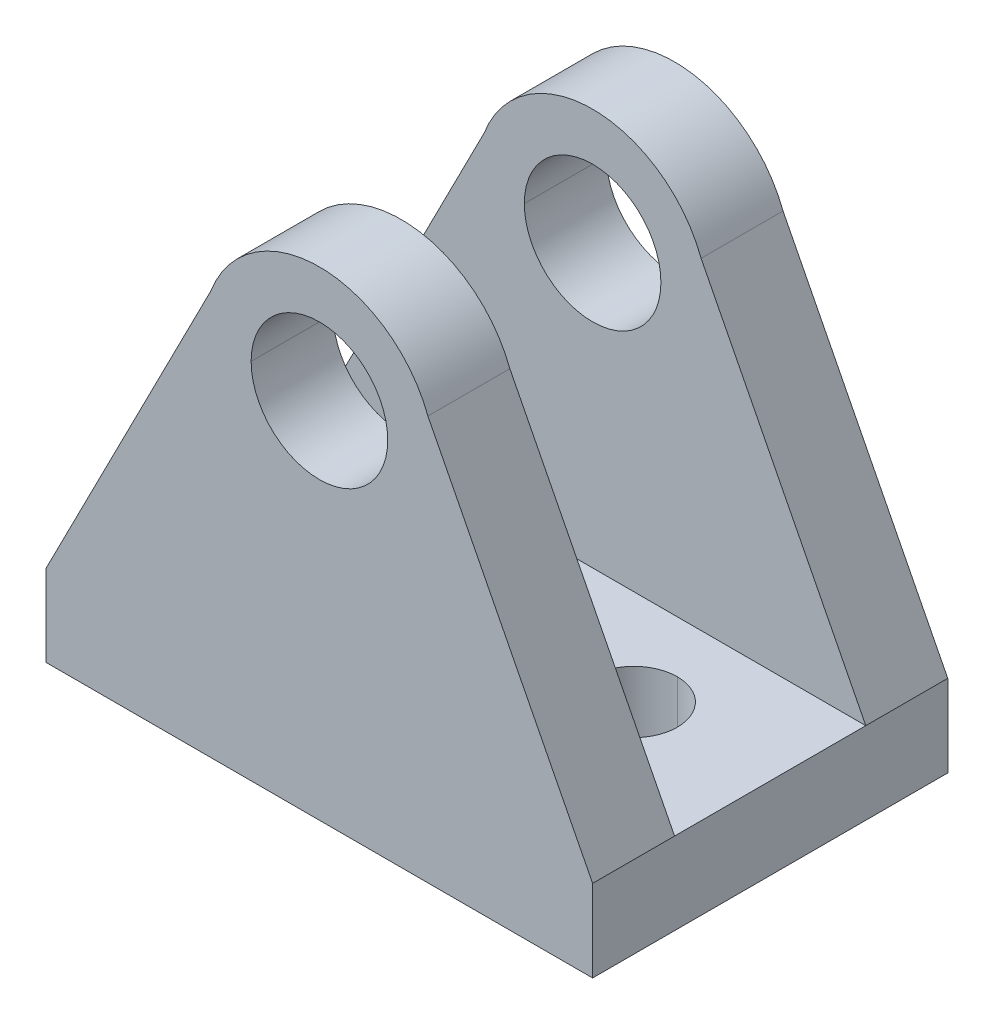
ISO-10303-21;
HEADER;
FILE_DESCRIPTION(('STEP AP214'),'2;1');
FILE_NAME('part.step','',(''),(''),'','','');
FILE_SCHEMA(('AUTOMOTIVE_DESIGN { 1 0 10303 214 1 1 1 1 }'));
ENDSEC;
DATA;
#1=APPLICATION_CONTEXT('core data for automotive mechanical design processes');
#2=APPLICATION_PROTOCOL_DEFINITION('international standard','automotive_design',2000,#1);
#3=PRODUCT_CONTEXT('',#1,'mechanical');
#4=PRODUCT('Part','Part','',(#3));
#5=PRODUCT_RELATED_PRODUCT_CATEGORY('part','',(#4));
#6=PRODUCT_DEFINITION_FORMATION('','',#4);
#7=PRODUCT_DEFINITION_CONTEXT('part definition',#1,'design');
#8=PRODUCT_DEFINITION('design','',#6,#7);
#9=PRODUCT_DEFINITION_SHAPE('','',#8);
#10=(LENGTH_UNIT() NAMED_UNIT(*) SI_UNIT(.MILLI.,.METRE.));
#11=(NAMED_UNIT(*) PLANE_ANGLE_UNIT() SI_UNIT($,.RADIAN.));
#12=(NAMED_UNIT(*) SI_UNIT($,.STERADIAN.) SOLID_ANGLE_UNIT());
#13=UNCERTAINTY_MEASURE_WITH_UNIT(LENGTH_MEASURE(1.E-05),#10,'distance_accuracy_value','');
#14=(GEOMETRIC_REPRESENTATION_CONTEXT(3) GLOBAL_UNCERTAINTY_ASSIGNED_CONTEXT((#13)) GLOBAL_UNIT_ASSIGNED_CONTEXT((#10,
#11,#12)) REPRESENTATION_CONTEXT('',''));
#15=CARTESIAN_POINT('',(0.,0.,0.));
#16=DIRECTION('',(0.,0.,1.));
#17=DIRECTION('',(1.,0.,0.));
#18=AXIS2_PLACEMENT_3D('',#15,#16,#17);
#19=CARTESIAN_POINT('',(35.3430691595237,13.3000053075812,-40.2194258680596));
#20=DIRECTION('',(0.,0.,-1.));
#21=DIRECTION('',(-1.,0.,0.));
#22=AXIS2_PLACEMENT_3D('',#19,#20,#21);
#23=CYLINDRICAL_SURFACE('',#22,2.5);
#24=CARTESIAN_POINT('',(35.3430691595237,13.3000053075812,-41.2194258680597));
#25=DIRECTION('',(0.,0.,-1.));
#26=DIRECTION('',(-1.,0.,0.));
#27=AXIS2_PLACEMENT_3D('',#24,#25,#26);
#28=CIRCLE('',#27,2.5);
#29=CARTESIAN_POINT('',(37.8430691595238,13.3000053075812,-41.2194258680597));
#30=VERTEX_POINT('',#29);
#31=CARTESIAN_POINT('',(32.8430691595237,13.3000053075812,-41.2194258680597));
#32=VERTEX_POINT('',#31);
#33=EDGE_CURVE('E41',#30,#32,#28,.T.);
#34=ORIENTED_EDGE('',*,*,#33,.F.);
#35=DIRECTION('',(0.,0.,-1.));
#36=VECTOR('',#35,1.);
#37=CARTESIAN_POINT('',(37.8430691595238,13.3000053075812,-40.2194258680596));
#38=LINE('',#37,#36);
#39=CARTESIAN_POINT('',(37.8430691595238,13.3000053075812,-44.2194258680597));
#40=VERTEX_POINT('',#39);
#41=EDGE_CURVE('E11',#30,#40,#38,.T.);
#42=ORIENTED_EDGE('',*,*,#41,.T.);
#43=CARTESIAN_POINT('',(35.3430691595237,13.3000053075812,-44.2194258680597));
#44=DIRECTION('',(0.,0.,-1.));
#45=DIRECTION('',(-1.,0.,0.));
#46=AXIS2_PLACEMENT_3D('',#43,#44,#45);
#47=CIRCLE('',#46,2.5);
#48=CARTESIAN_POINT('',(32.8430691595237,13.3000053075812,-44.2194258680597));
#49=VERTEX_POINT('',#48);
#50=EDGE_CURVE('E27',#40,#49,#47,.T.);
#51=ORIENTED_EDGE('',*,*,#50,.T.);
#52=DIRECTION('',(0.,0.,-1.));
#53=VECTOR('',#52,1.);
#54=CARTESIAN_POINT('',(32.8430691595237,13.3000053075812,-40.2194258680596));
#55=LINE('',#54,#53);
#56=EDGE_CURVE('E260',#32,#49,#55,.T.);
#57=ORIENTED_EDGE('',*,*,#56,.F.);
#58=EDGE_LOOP('',(#34,#42,#51,#57));
#59=FACE_BOUND('',#58,.T.);
#60=ADVANCED_FACE('F16',(#59),#23,.F.);
#61=CARTESIAN_POINT('',(35.3430691595237,13.3000053075812,-40.2194258680596));
#62=DIRECTION('',(0.,0.,-1.));
#63=DIRECTION('',(-1.,0.,0.));
#64=AXIS2_PLACEMENT_3D('',#61,#62,#63);
#65=CYLINDRICAL_SURFACE('',#64,2.5);
#66=CARTESIAN_POINT('',(35.3430691595237,13.3000053075812,-51.2194258680596));
#67=DIRECTION('',(0.,0.,1.));
#68=DIRECTION('',(1.,0.,0.));
#69=AXIS2_PLACEMENT_3D('',#66,#67,#68);
#70=CIRCLE('',#69,2.5);
#71=CARTESIAN_POINT('',(32.8430691595237,13.3000053075812,-51.2194258680596));
#72=VERTEX_POINT('',#71);
#73=CARTESIAN_POINT('',(37.8430691595238,13.3000053075812,-51.2194258680596));
#74=VERTEX_POINT('',#73);
#75=EDGE_CURVE('E303',#72,#74,#70,.T.);
#76=ORIENTED_EDGE('',*,*,#75,.T.);
#77=DIRECTION('',(0.,0.,-1.));
#78=VECTOR('',#77,1.);
#79=CARTESIAN_POINT('',(37.8430691595238,13.3000053075812,-40.2194258680596));
#80=LINE('',#79,#78);
#81=CARTESIAN_POINT('',(37.8430691595238,13.3000053075812,-54.2194258680596));
#82=VERTEX_POINT('',#81);
#83=EDGE_CURVE('E220',#74,#82,#80,.T.);
#84=ORIENTED_EDGE('',*,*,#83,.T.);
#85=CARTESIAN_POINT('',(35.3430691595237,13.3000053075812,-54.2194258680596));
#86=DIRECTION('',(0.,0.,-1.));
#87=DIRECTION('',(-1.,0.,0.));
#88=AXIS2_PLACEMENT_3D('',#85,#86,#87);
#89=CIRCLE('',#88,2.5);
#90=CARTESIAN_POINT('',(32.8430691595237,13.3000053075812,-54.2194258680596));
#91=VERTEX_POINT('',#90);
#92=EDGE_CURVE('E217',#82,#91,#89,.T.);
#93=ORIENTED_EDGE('',*,*,#92,.T.);
#94=DIRECTION('',(0.,0.,-1.));
#95=VECTOR('',#94,1.);
#96=CARTESIAN_POINT('',(32.8430691595237,13.3000053075812,-40.2194258680596));
#97=LINE('',#96,#95);
#98=EDGE_CURVE('E285',#72,#91,#97,.T.);
#99=ORIENTED_EDGE('',*,*,#98,.F.);
#100=EDGE_LOOP('',(#76,#84,#93,#99));
#101=FACE_BOUND('',#100,.T.);
#102=ADVANCED_FACE('F460',(#101),#65,.F.);
#103=CARTESIAN_POINT('',(30.3430756374335,3.,-47.7194258680598));
#104=DIRECTION('',(0.,-1.,0.));
#105=DIRECTION('',(0.,0.,-1.));
#106=AXIS2_PLACEMENT_3D('',#103,#104,#105);
#107=CYLINDRICAL_SURFACE('',#106,1.59999999999983);
#108=CARTESIAN_POINT('',(30.3430756374335,3.,-47.7194258680598));
#109=DIRECTION('',(0.,1.,0.));
#110=DIRECTION('',(0.,0.,1.));
#111=AXIS2_PLACEMENT_3D('',#108,#109,#110);
#112=CIRCLE('',#111,1.59999999999983);
#113=CARTESIAN_POINT('',(30.3430756374335,3.,-49.3194258680596));
#114=VERTEX_POINT('',#113);
#115=CARTESIAN_POINT('',(30.3430756374335,3.,-46.1194258680599));
#116=VERTEX_POINT('',#115);
#117=EDGE_CURVE('E221',#114,#116,#112,.T.);
#118=ORIENTED_EDGE('',*,*,#117,.T.);
#119=DIRECTION('',(0.,-1.,0.));
#120=VECTOR('',#119,1.);
#121=CARTESIAN_POINT('',(30.3430756374335,3.,-46.1194258680599));
#122=LINE('',#121,#120);
#123=CARTESIAN_POINT('',(30.3430756374335,0.,-46.1194258680599));
#124=VERTEX_POINT('',#123);
#125=EDGE_CURVE('E215',#116,#124,#122,.T.);
#126=ORIENTED_EDGE('',*,*,#125,.T.);
#127=CARTESIAN_POINT('',(30.3430756374335,0.,-47.7194258680598));
#128=DIRECTION('',(0.,1.,0.));
#129=DIRECTION('',(0.,0.,1.));
#130=AXIS2_PLACEMENT_3D('',#127,#128,#129);
#131=CIRCLE('',#130,1.59999999999983);
#132=CARTESIAN_POINT('',(30.3430756374335,0.,-49.3194258680596));
#133=VERTEX_POINT('',#132);
#134=EDGE_CURVE('E235',#133,#124,#131,.T.);
#135=ORIENTED_EDGE('',*,*,#134,.F.);
#136=DIRECTION('',(0.,-1.,0.));
#137=VECTOR('',#136,1.);
#138=CARTESIAN_POINT('',(30.3430756374335,3.,-49.3194258680596));
#139=LINE('',#138,#137);
#140=EDGE_CURVE('E241',#114,#133,#139,.T.);
#141=ORIENTED_EDGE('',*,*,#140,.F.);
#142=EDGE_LOOP('',(#118,#126,#135,#141));
#143=FACE_BOUND('',#142,.T.);
#144=ADVANCED_FACE('F444',(#143),#107,.F.);
#145=CARTESIAN_POINT('',(40.3430756374337,3.,-47.7194258680598));
#146=DIRECTION('',(0.,-1.,0.));
#147=DIRECTION('',(0.,0.,-1.));
#148=AXIS2_PLACEMENT_3D('',#145,#146,#147);
#149=CYLINDRICAL_SURFACE('',#148,1.59999999999983);
#150=CARTESIAN_POINT('',(40.3430756374337,3.,-47.7194258680598));
#151=DIRECTION('',(0.,1.,0.));
#152=DIRECTION('',(0.,0.,1.));
#153=AXIS2_PLACEMENT_3D('',#150,#151,#152);
#154=CIRCLE('',#153,1.59999999999983);
#155=CARTESIAN_POINT('',(40.3430756374337,3.,-49.3194258680596));
#156=VERTEX_POINT('',#155);
#157=CARTESIAN_POINT('',(40.3430756374337,3.,-46.1194258680599));
#158=VERTEX_POINT('',#157);
#159=EDGE_CURVE('E274',#156,#158,#154,.T.);
#160=ORIENTED_EDGE('',*,*,#159,.T.);
#161=DIRECTION('',(0.,-1.,0.));
#162=VECTOR('',#161,1.);
#163=CARTESIAN_POINT('',(40.3430756374337,3.,-46.1194258680599));
#164=LINE('',#163,#162);
#165=CARTESIAN_POINT('',(40.3430756374337,0.,-46.1194258680599));
#166=VERTEX_POINT('',#165);
#167=EDGE_CURVE('E270',#158,#166,#164,.T.);
#168=ORIENTED_EDGE('',*,*,#167,.T.);
#169=CARTESIAN_POINT('',(40.3430756374337,0.,-47.7194258680598));
#170=DIRECTION('',(0.,1.,0.));
#171=DIRECTION('',(0.,0.,1.));
#172=AXIS2_PLACEMENT_3D('',#169,#170,#171);
#173=CIRCLE('',#172,1.59999999999983);
#174=CARTESIAN_POINT('',(40.3430756374337,0.,-49.3194258680596));
#175=VERTEX_POINT('',#174);
#176=EDGE_CURVE('E350',#175,#166,#173,.T.);
#177=ORIENTED_EDGE('',*,*,#176,.F.);
#178=DIRECTION('',(0.,-1.,0.));
#179=VECTOR('',#178,1.);
#180=CARTESIAN_POINT('',(40.3430756374337,3.,-49.3194258680596));
#181=LINE('',#180,#179);
#182=EDGE_CURVE('E264',#156,#175,#181,.T.);
#183=ORIENTED_EDGE('',*,*,#182,.F.);
#184=EDGE_LOOP('',(#160,#168,#177,#183));
#185=FACE_BOUND('',#184,.T.);
#186=ADVANCED_FACE('F431',(#185),#149,.F.);
#187=CARTESIAN_POINT('',(0.,3.,0.));
#188=DIRECTION('',(0.,-1.,0.));
#189=DIRECTION('',(0.,0.,-1.));
#190=AXIS2_PLACEMENT_3D('',#187,#188,#189);
#191=PLANE('',#190);
#192=DIRECTION('',(0.,0.,-1.));
#193=VECTOR('',#192,1.);
#194=CARTESIAN_POINT('',(45.3430756374336,3.,-51.2194258680596));
#195=LINE('',#194,#193);
#196=CARTESIAN_POINT('',(45.3430756374336,3.,-44.2194258680597));
#197=VERTEX_POINT('',#196);
#198=CARTESIAN_POINT('',(45.3430756374336,3.,-51.2194258680596));
#199=VERTEX_POINT('',#198);
#200=EDGE_CURVE('E20',#197,#199,#195,.T.);
#201=ORIENTED_EDGE('',*,*,#200,.T.);
#202=DIRECTION('',(-1.,0.,0.));
#203=VECTOR('',#202,1.);
#204=CARTESIAN_POINT('',(45.3430756374336,3.,-51.2194258680596));
#205=LINE('',#204,#203);
#206=CARTESIAN_POINT('',(25.3430756374336,3.,-51.2194258680596));
#207=VERTEX_POINT('',#206);
#208=EDGE_CURVE('E222',#199,#207,#205,.T.);
#209=ORIENTED_EDGE('',*,*,#208,.T.);
#210=DIRECTION('',(0.,0.,1.));
#211=VECTOR('',#210,1.);
#212=CARTESIAN_POINT('',(25.3430756374336,3.,-51.2194258680596));
#213=LINE('',#212,#211);
#214=CARTESIAN_POINT('',(25.3430756374336,3.,-44.2194258680597));
#215=VERTEX_POINT('',#214);
#216=EDGE_CURVE('E180',#207,#215,#213,.T.);
#217=ORIENTED_EDGE('',*,*,#216,.T.);
#218=DIRECTION('',(1.,0.,0.));
#219=VECTOR('',#218,1.);
#220=CARTESIAN_POINT('',(45.3430756374336,3.,-44.2194258680597));
#221=LINE('',#220,#219);
#222=EDGE_CURVE('E353',#215,#197,#221,.T.);
#223=ORIENTED_EDGE('',*,*,#222,.T.);
#224=EDGE_LOOP('',(#201,#209,#217,#223));
#225=FACE_BOUND('',#224,.T.);
#226=ORIENTED_EDGE('',*,*,#159,.F.);
#227=CARTESIAN_POINT('',(40.3430756374337,3.,-47.7194258680598));
#228=DIRECTION('',(0.,1.,0.));
#229=DIRECTION('',(0.,0.,1.));
#230=AXIS2_PLACEMENT_3D('',#227,#228,#229);
#231=CIRCLE('',#230,1.59999999999983);
#232=EDGE_CURVE('E268',#158,#156,#231,.T.);
#233=ORIENTED_EDGE('',*,*,#232,.F.);
#234=EDGE_LOOP('',(#226,#233));
#235=FACE_BOUND('',#234,.T.);
#236=ORIENTED_EDGE('',*,*,#117,.F.);
#237=CARTESIAN_POINT('',(30.3430756374335,3.,-47.7194258680598));
#238=DIRECTION('',(0.,1.,0.));
#239=DIRECTION('',(0.,0.,1.));
#240=AXIS2_PLACEMENT_3D('',#237,#238,#239);
#241=CIRCLE('',#240,1.59999999999983);
#242=EDGE_CURVE('E269',#116,#114,#241,.T.);
#243=ORIENTED_EDGE('',*,*,#242,.F.);
#244=EDGE_LOOP('',(#236,#243));
#245=FACE_BOUND('',#244,.T.);
#246=ADVANCED_FACE('F384',(#225,#235,#245),#191,.F.);
#247=CARTESIAN_POINT('',(0.,0.,0.));
#248=DIRECTION('',(0.,-1.,0.));
#249=DIRECTION('',(0.,0.,-1.));
#250=AXIS2_PLACEMENT_3D('',#247,#248,#249);
#251=PLANE('',#250);
#252=DIRECTION('',(0.,0.,-1.));
#253=VECTOR('',#252,1.);
#254=CARTESIAN_POINT('',(45.3430756374336,0.,-51.2194258680596));
#255=LINE('',#254,#253);
#256=CARTESIAN_POINT('',(45.3430756374336,0.,-41.2194258680597));
#257=VERTEX_POINT('',#256);
#258=CARTESIAN_POINT('',(45.3430756374336,0.,-54.2194258680596));
#259=VERTEX_POINT('',#258);
#260=EDGE_CURVE('E236',#257,#259,#255,.T.);
#261=ORIENTED_EDGE('',*,*,#260,.F.);
#262=DIRECTION('',(1.,0.,0.));
#263=VECTOR('',#262,1.);
#264=CARTESIAN_POINT('',(25.3430756374336,0.,-41.2194258680597));
#265=LINE('',#264,#263);
#266=CARTESIAN_POINT('',(25.3430756374336,0.,-41.2194258680597));
#267=VERTEX_POINT('',#266);
#268=EDGE_CURVE('E242',#267,#257,#265,.T.);
#269=ORIENTED_EDGE('',*,*,#268,.F.);
#270=DIRECTION('',(0.,0.,1.));
#271=VECTOR('',#270,1.);
#272=CARTESIAN_POINT('',(25.3430756374336,0.,-51.2194258680596));
#273=LINE('',#272,#271);
#274=CARTESIAN_POINT('',(25.3430756374336,0.,-54.2194258680596));
#275=VERTEX_POINT('',#274);
#276=EDGE_CURVE('E339',#275,#267,#273,.T.);
#277=ORIENTED_EDGE('',*,*,#276,.F.);
#278=DIRECTION('',(-1.,0.,0.));
#279=VECTOR('',#278,1.);
#280=CARTESIAN_POINT('',(45.3430756374336,0.,-54.2194258680596));
#281=LINE('',#280,#279);
#282=EDGE_CURVE('E197',#259,#275,#281,.T.);
#283=ORIENTED_EDGE('',*,*,#282,.F.);
#284=EDGE_LOOP('',(#261,#269,#277,#283));
#285=FACE_BOUND('',#284,.T.);
#286=ORIENTED_EDGE('',*,*,#176,.T.);
#287=CARTESIAN_POINT('',(40.3430756374337,0.,-47.7194258680598));
#288=DIRECTION('',(0.,1.,0.));
#289=DIRECTION('',(0.,0.,1.));
#290=AXIS2_PLACEMENT_3D('',#287,#288,#289);
#291=CIRCLE('',#290,1.59999999999983);
#292=EDGE_CURVE('E354',#166,#175,#291,.T.);
#293=ORIENTED_EDGE('',*,*,#292,.T.);
#294=EDGE_LOOP('',(#286,#293));
#295=FACE_BOUND('',#294,.T.);
#296=ORIENTED_EDGE('',*,*,#134,.T.);
#297=CARTESIAN_POINT('',(30.3430756374335,0.,-47.7194258680598));
#298=DIRECTION('',(0.,1.,0.));
#299=DIRECTION('',(0.,0.,1.));
#300=AXIS2_PLACEMENT_3D('',#297,#298,#299);
#301=CIRCLE('',#300,1.59999999999983);
#302=EDGE_CURVE('E231',#124,#133,#301,.T.);
#303=ORIENTED_EDGE('',*,*,#302,.T.);
#304=EDGE_LOOP('',(#296,#303));
#305=FACE_BOUND('',#304,.T.);
#306=ADVANCED_FACE('F433',(#285,#295,#305),#251,.T.);
#307=CARTESIAN_POINT('',(45.3430756374336,3.,-51.2194258680596));
#308=DIRECTION('',(-1.,0.,0.));
#309=DIRECTION('',(0.,0.,1.));
#310=AXIS2_PLACEMENT_3D('',#307,#308,#309);
#311=PLANE('',#310);
#312=ORIENTED_EDGE('',*,*,#260,.T.);
#313=DIRECTION('',(0.,-1.,0.));
#314=VECTOR('',#313,1.);
#315=CARTESIAN_POINT('',(45.3430756374336,3.,-54.2194258680596));
#316=LINE('',#315,#314);
#317=CARTESIAN_POINT('',(45.3430756374336,3.,-54.2194258680596));
#318=VERTEX_POINT('',#317);
#319=EDGE_CURVE('E289',#318,#259,#316,.T.);
#320=ORIENTED_EDGE('',*,*,#319,.F.);
#321=DIRECTION('',(0.,0.,1.));
#322=VECTOR('',#321,1.);
#323=CARTESIAN_POINT('',(45.3430756374336,3.,-54.2194258680596));
#324=LINE('',#323,#322);
#325=EDGE_CURVE('E333',#318,#199,#324,.T.);
#326=ORIENTED_EDGE('',*,*,#325,.T.);
#327=ORIENTED_EDGE('',*,*,#200,.F.);
#328=DIRECTION('',(0.,0.,-1.));
#329=VECTOR('',#328,1.);
#330=CARTESIAN_POINT('',(45.3430756374336,3.,-41.2194258680597));
#331=LINE('',#330,#329);
#332=CARTESIAN_POINT('',(45.3430756374336,3.,-41.2194258680597));
#333=VERTEX_POINT('',#332);
#334=EDGE_CURVE('E312',#333,#197,#331,.T.);
#335=ORIENTED_EDGE('',*,*,#334,.F.);
#336=DIRECTION('',(0.,1.,0.));
#337=VECTOR('',#336,1.);
#338=CARTESIAN_POINT('',(45.3430756374336,3.,-41.2194258680597));
#339=LINE('',#338,#337);
#340=EDGE_CURVE('E255',#257,#333,#339,.T.);
#341=ORIENTED_EDGE('',*,*,#340,.F.);
#342=EDGE_LOOP('',(#312,#320,#326,#327,#335,#341));
#343=FACE_BOUND('',#342,.T.);
#344=ADVANCED_FACE('F436',(#343),#311,.F.);
#345=CARTESIAN_POINT('',(25.3430756374336,3.,-51.2194258680596));
#346=DIRECTION('',(1.,0.,0.));
#347=DIRECTION('',(0.,1.,0.));
#348=AXIS2_PLACEMENT_3D('',#345,#346,#347);
#349=PLANE('',#348);
#350=ORIENTED_EDGE('',*,*,#276,.T.);
#351=DIRECTION('',(0.,-1.,0.));
#352=VECTOR('',#351,1.);
#353=CARTESIAN_POINT('',(25.3430756374336,3.,-41.2194258680597));
#354=LINE('',#353,#352);
#355=CARTESIAN_POINT('',(25.3430756374336,3.,-41.2194258680597));
#356=VERTEX_POINT('',#355);
#357=EDGE_CURVE('E237',#356,#267,#354,.T.);
#358=ORIENTED_EDGE('',*,*,#357,.F.);
#359=DIRECTION('',(0.,0.,-1.));
#360=VECTOR('',#359,1.);
#361=CARTESIAN_POINT('',(25.3430756374336,3.,-41.2194258680597));
#362=LINE('',#361,#360);
#363=EDGE_CURVE('E342',#356,#215,#362,.T.);
#364=ORIENTED_EDGE('',*,*,#363,.T.);
#365=ORIENTED_EDGE('',*,*,#216,.F.);
#366=DIRECTION('',(0.,0.,1.));
#367=VECTOR('',#366,1.);
#368=CARTESIAN_POINT('',(25.3430756374336,3.,-54.2194258680596));
#369=LINE('',#368,#367);
#370=CARTESIAN_POINT('',(25.3430756374336,3.,-54.2194258680596));
#371=VERTEX_POINT('',#370);
#372=EDGE_CURVE('E174',#371,#207,#369,.T.);
#373=ORIENTED_EDGE('',*,*,#372,.F.);
#374=DIRECTION('',(0.,1.,0.));
#375=VECTOR('',#374,1.);
#376=CARTESIAN_POINT('',(25.3430756374336,3.,-54.2194258680596));
#377=LINE('',#376,#375);
#378=EDGE_CURVE('E178',#275,#371,#377,.T.);
#379=ORIENTED_EDGE('',*,*,#378,.F.);
#380=EDGE_LOOP('',(#350,#358,#364,#365,#373,#379));
#381=FACE_BOUND('',#380,.T.);
#382=ADVANCED_FACE('F177',(#381),#349,.F.);
#383=CARTESIAN_POINT('',(40.3430756374337,3.,-47.7194258680598));
#384=DIRECTION('',(0.,-1.,0.));
#385=DIRECTION('',(0.,0.,-1.));
#386=AXIS2_PLACEMENT_3D('',#383,#384,#385);
#387=CYLINDRICAL_SURFACE('',#386,1.59999999999983);
#388=ORIENTED_EDGE('',*,*,#167,.F.);
#389=ORIENTED_EDGE('',*,*,#232,.T.);
#390=ORIENTED_EDGE('',*,*,#182,.T.);
#391=ORIENTED_EDGE('',*,*,#292,.F.);
#392=EDGE_LOOP('',(#388,#389,#390,#391));
#393=FACE_BOUND('',#392,.T.);
#394=ADVANCED_FACE('F425',(#393),#387,.F.);
#395=CARTESIAN_POINT('',(30.3430756374335,3.,-47.7194258680598));
#396=DIRECTION('',(0.,-1.,0.));
#397=DIRECTION('',(0.,0.,-1.));
#398=AXIS2_PLACEMENT_3D('',#395,#396,#397);
#399=CYLINDRICAL_SURFACE('',#398,1.59999999999983);
#400=ORIENTED_EDGE('',*,*,#125,.F.);
#401=ORIENTED_EDGE('',*,*,#242,.T.);
#402=ORIENTED_EDGE('',*,*,#140,.T.);
#403=ORIENTED_EDGE('',*,*,#302,.F.);
#404=EDGE_LOOP('',(#400,#401,#402,#403));
#405=FACE_BOUND('',#404,.T.);
#406=ADVANCED_FACE('F448',(#405),#399,.F.);
#407=CARTESIAN_POINT('',(35.3430756374336,13.3,-44.2194258680597));
#408=DIRECTION('',(0.,0.,-1.));
#409=DIRECTION('',(0.,-1.,0.));
#410=AXIS2_PLACEMENT_3D('',#407,#408,#409);
#411=PLANE('',#410);
#412=ORIENTED_EDGE('',*,*,#222,.F.);
#413=DIRECTION('',(-0.45499090568648,-0.890496084069209,0.));
#414=VECTOR('',#413,1.);
#415=CARTESIAN_POINT('',(25.3430756374336,3.,-44.2194258680597));
#416=LINE('',#415,#414);
#417=CARTESIAN_POINT('',(31.3721787218253,14.8,-44.2194258680597));
#418=VERTEX_POINT('',#417);
#419=EDGE_CURVE('E246',#418,#215,#416,.T.);
#420=ORIENTED_EDGE('',*,*,#419,.F.);
#421=CARTESIAN_POINT('',(35.3430756374336,13.3,-44.2194258680597));
#422=DIRECTION('',(0.,0.,1.));
#423=DIRECTION('',(-1.,0.,0.));
#424=AXIS2_PLACEMENT_3D('',#421,#422,#423);
#425=CIRCLE('',#424,4.24476410585876);
#426=CARTESIAN_POINT('',(39.3139725530418,14.8,-44.2194258680597));
#427=VERTEX_POINT('',#426);
#428=EDGE_CURVE('E320',#427,#418,#425,.T.);
#429=ORIENTED_EDGE('',*,*,#428,.F.);
#430=DIRECTION('',(-0.45499090568648,0.890496084069209,0.));
#431=VECTOR('',#430,1.);
#432=CARTESIAN_POINT('',(39.3139725530418,14.8,-44.2194258680597));
#433=LINE('',#432,#431);
#434=EDGE_CURVE('E278',#197,#427,#433,.T.);
#435=ORIENTED_EDGE('',*,*,#434,.F.);
#436=EDGE_LOOP('',(#412,#420,#429,#435));
#437=FACE_BOUND('',#436,.T.);
#438=CARTESIAN_POINT('',(35.3430691595237,13.3000053075812,-44.2194258680597));
#439=DIRECTION('',(0.,0.,-1.));
#440=DIRECTION('',(-1.,0.,0.));
#441=AXIS2_PLACEMENT_3D('',#438,#439,#440);
#442=CIRCLE('',#441,2.5);
#443=EDGE_CURVE('E256',#49,#40,#442,.T.);
#444=ORIENTED_EDGE('',*,*,#443,.F.);
#445=ORIENTED_EDGE('',*,*,#50,.F.);
#446=EDGE_LOOP('',(#444,#445));
#447=FACE_BOUND('',#446,.T.);
#448=ADVANCED_FACE('F396',(#437,#447),#411,.T.);
#449=CARTESIAN_POINT('',(35.3430756374336,13.3,-41.2194258680597));
#450=DIRECTION('',(0.,0.,-1.));
#451=DIRECTION('',(0.,-1.,0.));
#452=AXIS2_PLACEMENT_3D('',#449,#450,#451);
#453=PLANE('',#452);
#454=ORIENTED_EDGE('',*,*,#357,.T.);
#455=ORIENTED_EDGE('',*,*,#268,.T.);
#456=ORIENTED_EDGE('',*,*,#340,.T.);
#457=DIRECTION('',(-0.45499090568648,0.890496084069209,0.));
#458=VECTOR('',#457,1.);
#459=CARTESIAN_POINT('',(39.3139725530418,14.8,-41.2194258680597));
#460=LINE('',#459,#458);
#461=CARTESIAN_POINT('',(39.3139725530418,14.8,-41.2194258680597));
#462=VERTEX_POINT('',#461);
#463=EDGE_CURVE('E228',#333,#462,#460,.T.);
#464=ORIENTED_EDGE('',*,*,#463,.T.);
#465=CARTESIAN_POINT('',(35.3430756374336,13.3,-41.2194258680597));
#466=DIRECTION('',(0.,0.,1.));
#467=DIRECTION('',(-1.,0.,0.));
#468=AXIS2_PLACEMENT_3D('',#465,#466,#467);
#469=CIRCLE('',#468,4.24476410585876);
#470=CARTESIAN_POINT('',(31.3721787218253,14.8,-41.2194258680597));
#471=VERTEX_POINT('',#470);
#472=EDGE_CURVE('E225',#462,#471,#469,.T.);
#473=ORIENTED_EDGE('',*,*,#472,.T.);
#474=DIRECTION('',(-0.45499090568648,-0.890496084069209,0.));
#475=VECTOR('',#474,1.);
#476=CARTESIAN_POINT('',(25.3430756374336,3.,-41.2194258680597));
#477=LINE('',#476,#475);
#478=EDGE_CURVE('E229',#471,#356,#477,.T.);
#479=ORIENTED_EDGE('',*,*,#478,.T.);
#480=EDGE_LOOP('',(#454,#455,#456,#464,#473,#479));
#481=FACE_BOUND('',#480,.T.);
#482=CARTESIAN_POINT('',(35.3430691595237,13.3000053075812,-41.2194258680597));
#483=DIRECTION('',(0.,0.,-1.));
#484=DIRECTION('',(-1.,0.,0.));
#485=AXIS2_PLACEMENT_3D('',#482,#483,#484);
#486=CIRCLE('',#485,2.5);
#487=EDGE_CURVE('E277',#32,#30,#486,.T.);
#488=ORIENTED_EDGE('',*,*,#487,.T.);
#489=ORIENTED_EDGE('',*,*,#33,.T.);
#490=EDGE_LOOP('',(#488,#489));
#491=FACE_BOUND('',#490,.T.);
#492=ADVANCED_FACE('F480',(#481,#491),#453,.F.);
#493=CARTESIAN_POINT('',(39.3139725530418,14.8,-41.2194258680597));
#494=DIRECTION('',(-0.890496084069209,-0.45499090568648,0.));
#495=DIRECTION('',(-0.45499090568648,0.890496084069209,0.));
#496=AXIS2_PLACEMENT_3D('',#493,#494,#495);
#497=PLANE('',#496);
#498=ORIENTED_EDGE('',*,*,#434,.T.);
#499=DIRECTION('',(0.,0.,-1.));
#500=VECTOR('',#499,1.);
#501=CARTESIAN_POINT('',(39.3139725530418,14.8,-41.2194258680597));
#502=LINE('',#501,#500);
#503=EDGE_CURVE('E250',#462,#427,#502,.T.);
#504=ORIENTED_EDGE('',*,*,#503,.F.);
#505=ORIENTED_EDGE('',*,*,#463,.F.);
#506=ORIENTED_EDGE('',*,*,#334,.T.);
#507=EDGE_LOOP('',(#498,#504,#505,#506));
#508=FACE_BOUND('',#507,.T.);
#509=ADVANCED_FACE('F483',(#508),#497,.F.);
#510=CARTESIAN_POINT('',(35.3430756374336,13.3,-41.2194258680597));
#511=DIRECTION('',(0.,0.,-1.));
#512=DIRECTION('',(-1.,0.,0.));
#513=AXIS2_PLACEMENT_3D('',#510,#511,#512);
#514=CYLINDRICAL_SURFACE('',#513,4.24476410585876);
#515=ORIENTED_EDGE('',*,*,#428,.T.);
#516=DIRECTION('',(0.,0.,-1.));
#517=VECTOR('',#516,1.);
#518=CARTESIAN_POINT('',(31.3721787218253,14.8,-41.2194258680597));
#519=LINE('',#518,#517);
#520=EDGE_CURVE('E251',#471,#418,#519,.T.);
#521=ORIENTED_EDGE('',*,*,#520,.F.);
#522=ORIENTED_EDGE('',*,*,#472,.F.);
#523=ORIENTED_EDGE('',*,*,#503,.T.);
#524=EDGE_LOOP('',(#515,#521,#522,#523));
#525=FACE_BOUND('',#524,.T.);
#526=ADVANCED_FACE('F399',(#525),#514,.T.);
#527=CARTESIAN_POINT('',(25.3430756374336,3.,-41.2194258680597));
#528=DIRECTION('',(0.890496084069209,-0.45499090568648,0.));
#529=DIRECTION('',(0.,0.,-1.));
#530=AXIS2_PLACEMENT_3D('',#527,#528,#529);
#531=PLANE('',#530);
#532=ORIENTED_EDGE('',*,*,#419,.T.);
#533=ORIENTED_EDGE('',*,*,#363,.F.);
#534=ORIENTED_EDGE('',*,*,#478,.F.);
#535=ORIENTED_EDGE('',*,*,#520,.T.);
#536=EDGE_LOOP('',(#532,#533,#534,#535));
#537=FACE_BOUND('',#536,.T.);
#538=ADVANCED_FACE('F392',(#537),#531,.F.);
#539=CARTESIAN_POINT('',(35.3430691595237,13.3000053075812,-51.2194258680596));
#540=DIRECTION('',(0.,0.,1.));
#541=DIRECTION('',(1.,0.,0.));
#542=AXIS2_PLACEMENT_3D('',#539,#540,#541);
#543=PLANE('',#542);
#544=ORIENTED_EDGE('',*,*,#208,.F.);
#545=DIRECTION('',(0.454991131058374,-0.890495968917446,0.));
#546=VECTOR('',#545,1.);
#547=CARTESIAN_POINT('',(45.3430756374336,3.,-51.2194258680596));
#548=LINE('',#547,#546);
#549=CARTESIAN_POINT('',(39.313966075132,14.8000053075813,-51.2194258680596));
#550=VERTEX_POINT('',#549);
#551=EDGE_CURVE('E263',#550,#199,#548,.T.);
#552=ORIENTED_EDGE('',*,*,#551,.F.);
#553=CARTESIAN_POINT('',(35.3430691595237,13.3000053075812,-51.2194258680596));
#554=DIRECTION('',(0.,0.,-1.));
#555=DIRECTION('',(1.,0.,0.));
#556=AXIS2_PLACEMENT_3D('',#553,#554,#555);
#557=CIRCLE('',#556,4.24476410585876);
#558=CARTESIAN_POINT('',(31.3721722439155,14.8000053075813,-51.2194258680596));
#559=VERTEX_POINT('',#558);
#560=EDGE_CURVE('E187',#559,#550,#557,.T.);
#561=ORIENTED_EDGE('',*,*,#560,.F.);
#562=DIRECTION('',(0.454990355742183,0.890496365058051,0.));
#563=VECTOR('',#562,1.);
#564=CARTESIAN_POINT('',(31.3721722439155,14.8000053075813,-51.2194258680596));
#565=LINE('',#564,#563);
#566=EDGE_CURVE('E186',#207,#559,#565,.T.);
#567=ORIENTED_EDGE('',*,*,#566,.F.);
#568=EDGE_LOOP('',(#544,#552,#561,#567));
#569=FACE_BOUND('',#568,.T.);
#570=ORIENTED_EDGE('',*,*,#75,.F.);
#571=CARTESIAN_POINT('',(35.3430691595237,13.3000053075812,-51.2194258680596));
#572=DIRECTION('',(0.,0.,1.));
#573=DIRECTION('',(1.,0.,0.));
#574=AXIS2_PLACEMENT_3D('',#571,#572,#573);
#575=CIRCLE('',#574,2.5);
#576=EDGE_CURVE('E357',#74,#72,#575,.T.);
#577=ORIENTED_EDGE('',*,*,#576,.F.);
#578=EDGE_LOOP('',(#570,#577));
#579=FACE_BOUND('',#578,.T.);
#580=ADVANCED_FACE('F474',(#569,#579),#543,.T.);
#581=CARTESIAN_POINT('',(35.3430691595237,13.3000053075812,-54.2194258680596));
#582=DIRECTION('',(0.,0.,1.));
#583=DIRECTION('',(1.,0.,0.));
#584=AXIS2_PLACEMENT_3D('',#581,#582,#583);
#585=PLANE('',#584);
#586=ORIENTED_EDGE('',*,*,#319,.T.);
#587=ORIENTED_EDGE('',*,*,#282,.T.);
#588=ORIENTED_EDGE('',*,*,#378,.T.);
#589=DIRECTION('',(0.454990355742183,0.890496365058051,0.));
#590=VECTOR('',#589,1.);
#591=CARTESIAN_POINT('',(31.3721722439155,14.8000053075813,-54.2194258680596));
#592=LINE('',#591,#590);
#593=CARTESIAN_POINT('',(31.3721722439155,14.8000053075813,-54.2194258680596));
#594=VERTEX_POINT('',#593);
#595=EDGE_CURVE('E195',#371,#594,#592,.T.);
#596=ORIENTED_EDGE('',*,*,#595,.T.);
#597=CARTESIAN_POINT('',(35.3430691595237,13.3000053075812,-54.2194258680596));
#598=DIRECTION('',(0.,0.,-1.));
#599=DIRECTION('',(1.,0.,0.));
#600=AXIS2_PLACEMENT_3D('',#597,#598,#599);
#601=CIRCLE('',#600,4.24476410585876);
#602=CARTESIAN_POINT('',(39.313966075132,14.8000053075813,-54.2194258680596));
#603=VERTEX_POINT('',#602);
#604=EDGE_CURVE('E205',#594,#603,#601,.T.);
#605=ORIENTED_EDGE('',*,*,#604,.T.);
#606=DIRECTION('',(0.454991131058374,-0.890495968917446,0.));
#607=VECTOR('',#606,1.);
#608=CARTESIAN_POINT('',(45.3430756374336,3.,-54.2194258680596));
#609=LINE('',#608,#607);
#610=EDGE_CURVE('E212',#603,#318,#609,.T.);
#611=ORIENTED_EDGE('',*,*,#610,.T.);
#612=EDGE_LOOP('',(#586,#587,#588,#596,#605,#611));
#613=FACE_BOUND('',#612,.T.);
#614=CARTESIAN_POINT('',(35.3430691595237,13.3000053075812,-54.2194258680596));
#615=DIRECTION('',(0.,0.,-1.));
#616=DIRECTION('',(-1.,0.,0.));
#617=AXIS2_PLACEMENT_3D('',#614,#615,#616);
#618=CIRCLE('',#617,2.5);
#619=EDGE_CURVE('E281',#91,#82,#618,.T.);
#620=ORIENTED_EDGE('',*,*,#619,.F.);
#621=ORIENTED_EDGE('',*,*,#92,.F.);
#622=EDGE_LOOP('',(#620,#621));
#623=FACE_BOUND('',#622,.T.);
#624=ADVANCED_FACE('F192',(#613,#623),#585,.F.);
#625=CARTESIAN_POINT('',(31.3721722439155,14.8000053075813,-54.2194258680596));
#626=DIRECTION('',(0.890496365058051,-0.454990355742182,0.));
#627=DIRECTION('',(0.,0.,-1.));
#628=AXIS2_PLACEMENT_3D('',#625,#626,#627);
#629=PLANE('',#628);
#630=ORIENTED_EDGE('',*,*,#566,.T.);
#631=DIRECTION('',(0.,0.,1.));
#632=VECTOR('',#631,1.);
#633=CARTESIAN_POINT('',(31.3721722439155,14.8000053075813,-54.2194258680596));
#634=LINE('',#633,#632);
#635=EDGE_CURVE('E203',#594,#559,#634,.T.);
#636=ORIENTED_EDGE('',*,*,#635,.F.);
#637=ORIENTED_EDGE('',*,*,#595,.F.);
#638=ORIENTED_EDGE('',*,*,#372,.T.);
#639=EDGE_LOOP('',(#630,#636,#637,#638));
#640=FACE_BOUND('',#639,.T.);
#641=ADVANCED_FACE('F201',(#640),#629,.F.);
#642=CARTESIAN_POINT('',(35.3430691595237,13.3000053075812,-54.2194258680596));
#643=DIRECTION('',(0.,0.,1.));
#644=DIRECTION('',(1.,0.,0.));
#645=AXIS2_PLACEMENT_3D('',#642,#643,#644);
#646=CYLINDRICAL_SURFACE('',#645,4.24476410585876);
#647=ORIENTED_EDGE('',*,*,#560,.T.);
#648=DIRECTION('',(0.,0.,1.));
#649=VECTOR('',#648,1.);
#650=CARTESIAN_POINT('',(39.313966075132,14.8000053075813,-54.2194258680596));
#651=LINE('',#650,#649);
#652=EDGE_CURVE('E297',#603,#550,#651,.T.);
#653=ORIENTED_EDGE('',*,*,#652,.F.);
#654=ORIENTED_EDGE('',*,*,#604,.F.);
#655=ORIENTED_EDGE('',*,*,#635,.T.);
#656=EDGE_LOOP('',(#647,#653,#654,#655));
#657=FACE_BOUND('',#656,.T.);
#658=ADVANCED_FACE('F490',(#657),#646,.T.);
#659=CARTESIAN_POINT('',(45.3430756374336,3.,-54.2194258680596));
#660=DIRECTION('',(-0.890495968917446,-0.454991131058374,0.));
#661=DIRECTION('',(-0.454991131058374,0.890495968917446,0.));
#662=AXIS2_PLACEMENT_3D('',#659,#660,#661);
#663=PLANE('',#662);
#664=ORIENTED_EDGE('',*,*,#551,.T.);
#665=ORIENTED_EDGE('',*,*,#325,.F.);
#666=ORIENTED_EDGE('',*,*,#610,.F.);
#667=ORIENTED_EDGE('',*,*,#652,.T.);
#668=EDGE_LOOP('',(#664,#665,#666,#667));
#669=FACE_BOUND('',#668,.T.);
#670=ADVANCED_FACE('F18',(#669),#663,.F.);
#671=CARTESIAN_POINT('',(35.3430691595237,13.3000053075812,-40.2194258680596));
#672=DIRECTION('',(0.,0.,-1.));
#673=DIRECTION('',(-1.,0.,0.));
#674=AXIS2_PLACEMENT_3D('',#671,#672,#673);
#675=CYLINDRICAL_SURFACE('',#674,2.5);
#676=ORIENTED_EDGE('',*,*,#83,.F.);
#677=ORIENTED_EDGE('',*,*,#576,.T.);
#678=ORIENTED_EDGE('',*,*,#98,.T.);
#679=ORIENTED_EDGE('',*,*,#619,.T.);
#680=EDGE_LOOP('',(#676,#677,#678,#679));
#681=FACE_BOUND('',#680,.T.);
#682=ADVANCED_FACE('F496',(#681),#675,.F.);
#683=CARTESIAN_POINT('',(35.3430691595237,13.3000053075812,-40.2194258680596));
#684=DIRECTION('',(0.,0.,-1.));
#685=DIRECTION('',(-1.,0.,0.));
#686=AXIS2_PLACEMENT_3D('',#683,#684,#685);
#687=CYLINDRICAL_SURFACE('',#686,2.5);
#688=ORIENTED_EDGE('',*,*,#41,.F.);
#689=ORIENTED_EDGE('',*,*,#487,.F.);
#690=ORIENTED_EDGE('',*,*,#56,.T.);
#691=ORIENTED_EDGE('',*,*,#443,.T.);
#692=EDGE_LOOP('',(#688,#689,#690,#691));
#693=FACE_BOUND('',#692,.T.);
#694=ADVANCED_FACE('F498',(#693),#687,.F.);
#695=CLOSED_SHELL('',(#60,#102,#144,#186,#246,#306,#344,#382,#394,#406,#448,#492,#509,#526,#538,
#580,#624,#641,#658,#670,#682,#694));
#696=MANIFOLD_SOLID_BREP('B1',#695);
#697=ADVANCED_BREP_SHAPE_REPRESENTATION('',(#18,#696),#14);
#698=SHAPE_DEFINITION_REPRESENTATION(#9,#697);
ENDSEC;
END-ISO-10303-21;
